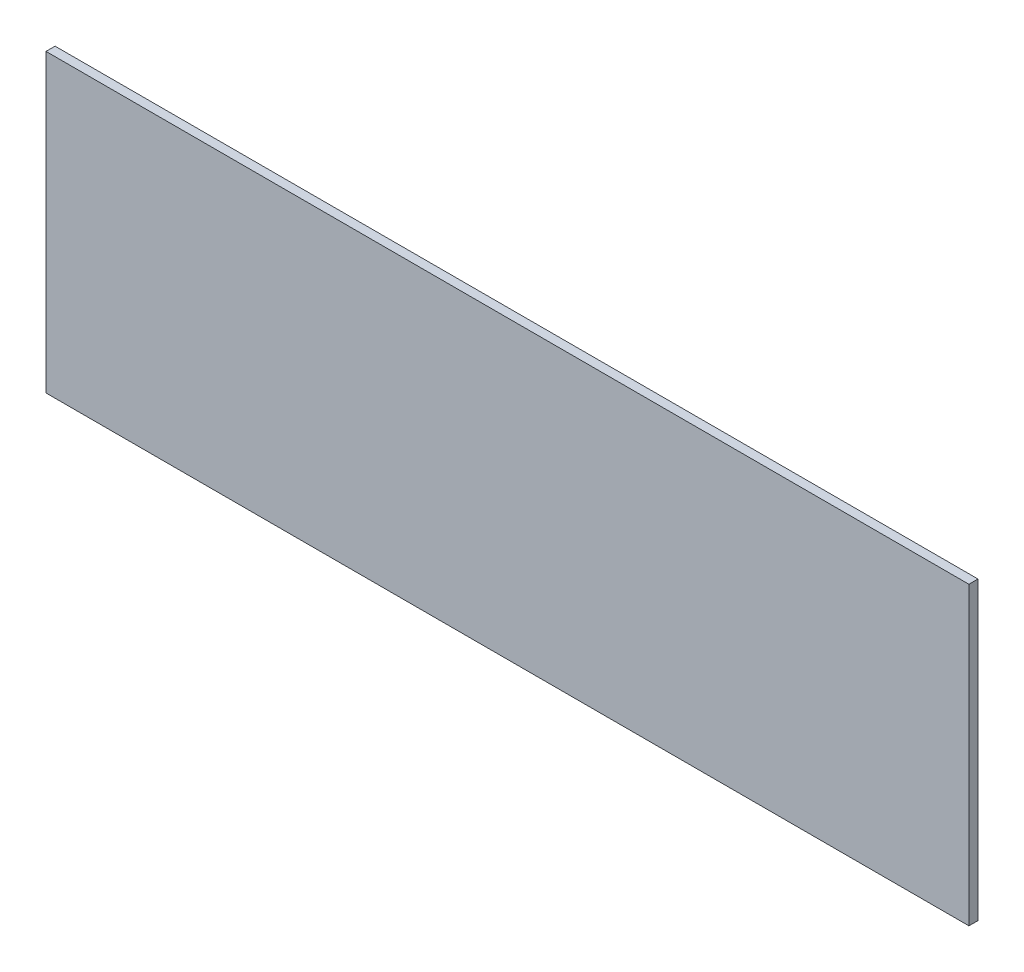
ISO-10303-21;
HEADER;
FILE_DESCRIPTION(('STEP AP214'),'2;1');
FILE_NAME('part.step','',(''),(''),'','','');
FILE_SCHEMA(('AUTOMOTIVE_DESIGN { 1 0 10303 214 1 1 1 1 }'));
ENDSEC;
DATA;
#1=APPLICATION_CONTEXT('core data for automotive mechanical design processes');
#2=APPLICATION_PROTOCOL_DEFINITION('international standard','automotive_design',2000,#1);
#3=PRODUCT_CONTEXT('',#1,'mechanical');
#4=PRODUCT('Part','Part','',(#3));
#5=PRODUCT_RELATED_PRODUCT_CATEGORY('part','',(#4));
#6=PRODUCT_DEFINITION_FORMATION('','',#4);
#7=PRODUCT_DEFINITION_CONTEXT('part definition',#1,'design');
#8=PRODUCT_DEFINITION('design','',#6,#7);
#9=PRODUCT_DEFINITION_SHAPE('','',#8);
#10=(LENGTH_UNIT() NAMED_UNIT(*) SI_UNIT(.MILLI.,.METRE.));
#11=(NAMED_UNIT(*) PLANE_ANGLE_UNIT() SI_UNIT($,.RADIAN.));
#12=(NAMED_UNIT(*) SI_UNIT($,.STERADIAN.) SOLID_ANGLE_UNIT());
#13=UNCERTAINTY_MEASURE_WITH_UNIT(LENGTH_MEASURE(1.E-05),#10,'distance_accuracy_value','');
#14=(GEOMETRIC_REPRESENTATION_CONTEXT(3) GLOBAL_UNCERTAINTY_ASSIGNED_CONTEXT((#13)) GLOBAL_UNIT_ASSIGNED_CONTEXT((#10,
#11,#12)) REPRESENTATION_CONTEXT('',''));
#15=CARTESIAN_POINT('',(0.,0.,0.));
#16=DIRECTION('',(0.,0.,1.));
#17=DIRECTION('',(1.,0.,0.));
#18=AXIS2_PLACEMENT_3D('',#15,#16,#17);
#19=CARTESIAN_POINT('',(-48.3058591698295,34.6046972198337,1.));
#20=DIRECTION('',(1.,0.,0.));
#21=DIRECTION('',(0.,0.,-1.));
#22=AXIS2_PLACEMENT_3D('',#19,#20,#21);
#23=PLANE('',#22);
#24=DIRECTION('',(0.,-1.,0.));
#25=VECTOR('',#24,1.);
#26=CARTESIAN_POINT('',(-48.3058591698295,34.6046972198337,0.));
#27=LINE('',#26,#25);
#28=CARTESIAN_POINT('',(-48.3058591698295,34.6046972198337,0.));
#29=VERTEX_POINT('',#28);
#30=CARTESIAN_POINT('',(-48.3058591698295,2.02210000082914,0.));
#31=VERTEX_POINT('',#30);
#32=EDGE_CURVE('E100',#29,#31,#27,.T.);
#33=ORIENTED_EDGE('',*,*,#32,.T.);
#34=DIRECTION('',(0.,0.,-1.));
#35=VECTOR('',#34,1.);
#36=CARTESIAN_POINT('',(-48.3058591698295,2.02210000082914,1.));
#37=LINE('',#36,#35);
#38=CARTESIAN_POINT('',(-48.3058591698295,2.02210000082914,1.));
#39=VERTEX_POINT('',#38);
#40=EDGE_CURVE('E11',#39,#31,#37,.T.);
#41=ORIENTED_EDGE('',*,*,#40,.F.);
#42=DIRECTION('',(0.,-1.,0.));
#43=VECTOR('',#42,1.);
#44=CARTESIAN_POINT('',(-48.3058591698295,34.6046972198337,1.));
#45=LINE('',#44,#43);
#46=CARTESIAN_POINT('',(-48.3058591698295,34.6046972198337,1.));
#47=VERTEX_POINT('',#46);
#48=EDGE_CURVE('E88',#47,#39,#45,.T.);
#49=ORIENTED_EDGE('',*,*,#48,.F.);
#50=DIRECTION('',(0.,0.,-1.));
#51=VECTOR('',#50,1.);
#52=CARTESIAN_POINT('',(-48.3058591698295,34.6046972198337,1.));
#53=LINE('',#52,#51);
#54=EDGE_CURVE('E96',#47,#29,#53,.T.);
#55=ORIENTED_EDGE('',*,*,#54,.T.);
#56=EDGE_LOOP('',(#33,#41,#49,#55));
#57=FACE_BOUND('',#56,.T.);
#58=ADVANCED_FACE('F37',(#57),#23,.F.);
#59=CARTESIAN_POINT('',(-48.3058591698295,2.02210000082914,1.));
#60=DIRECTION('',(0.,1.,0.));
#61=DIRECTION('',(0.,0.,1.));
#62=AXIS2_PLACEMENT_3D('',#59,#60,#61);
#63=PLANE('',#62);
#64=DIRECTION('',(1.,0.,0.));
#65=VECTOR('',#64,1.);
#66=CARTESIAN_POINT('',(-48.3058591698295,2.02210000082914,0.));
#67=LINE('',#66,#65);
#68=CARTESIAN_POINT('',(53.3404207123418,2.02210000082914,0.));
#69=VERTEX_POINT('',#68);
#70=EDGE_CURVE('E92',#31,#69,#67,.T.);
#71=ORIENTED_EDGE('',*,*,#70,.T.);
#72=DIRECTION('',(0.,0.,-1.));
#73=VECTOR('',#72,1.);
#74=CARTESIAN_POINT('',(53.3404207123418,2.02210000082914,1.));
#75=LINE('',#74,#73);
#76=CARTESIAN_POINT('',(53.3404207123418,2.02210000082914,1.));
#77=VERTEX_POINT('',#76);
#78=EDGE_CURVE('E45',#77,#69,#75,.T.);
#79=ORIENTED_EDGE('',*,*,#78,.F.);
#80=DIRECTION('',(1.,0.,0.));
#81=VECTOR('',#80,1.);
#82=CARTESIAN_POINT('',(-48.3058591698295,2.02210000082914,1.));
#83=LINE('',#82,#81);
#84=EDGE_CURVE('E83',#39,#77,#83,.T.);
#85=ORIENTED_EDGE('',*,*,#84,.F.);
#86=ORIENTED_EDGE('',*,*,#40,.T.);
#87=EDGE_LOOP('',(#71,#79,#85,#86));
#88=FACE_BOUND('',#87,.T.);
#89=ADVANCED_FACE('F91',(#88),#63,.F.);
#90=CARTESIAN_POINT('',(53.3404207123418,34.6046972198337,1.));
#91=DIRECTION('',(-1.,0.,0.));
#92=DIRECTION('',(0.,0.,1.));
#93=AXIS2_PLACEMENT_3D('',#90,#91,#92);
#94=PLANE('',#93);
#95=DIRECTION('',(0.,1.,0.));
#96=VECTOR('',#95,1.);
#97=CARTESIAN_POINT('',(53.3404207123418,34.6046972198337,0.));
#98=LINE('',#97,#96);
#99=CARTESIAN_POINT('',(53.3404207123418,34.6046972198337,0.));
#100=VERTEX_POINT('',#99);
#101=EDGE_CURVE('E70',#69,#100,#98,.T.);
#102=ORIENTED_EDGE('',*,*,#101,.T.);
#103=DIRECTION('',(0.,0.,-1.));
#104=VECTOR('',#103,1.);
#105=CARTESIAN_POINT('',(53.3404207123418,34.6046972198337,1.));
#106=LINE('',#105,#104);
#107=CARTESIAN_POINT('',(53.3404207123418,34.6046972198337,1.));
#108=VERTEX_POINT('',#107);
#109=EDGE_CURVE('E93',#108,#100,#106,.T.);
#110=ORIENTED_EDGE('',*,*,#109,.F.);
#111=DIRECTION('',(0.,1.,0.));
#112=VECTOR('',#111,1.);
#113=CARTESIAN_POINT('',(53.3404207123418,34.6046972198337,1.));
#114=LINE('',#113,#112);
#115=EDGE_CURVE('E86',#77,#108,#114,.T.);
#116=ORIENTED_EDGE('',*,*,#115,.F.);
#117=ORIENTED_EDGE('',*,*,#78,.T.);
#118=EDGE_LOOP('',(#102,#110,#116,#117));
#119=FACE_BOUND('',#118,.T.);
#120=ADVANCED_FACE('F94',(#119),#94,.F.);
#121=CARTESIAN_POINT('',(-48.3058591698295,34.6046972198337,1.));
#122=DIRECTION('',(0.,-1.,0.));
#123=DIRECTION('',(0.,0.,-1.));
#124=AXIS2_PLACEMENT_3D('',#121,#122,#123);
#125=PLANE('',#124);
#126=DIRECTION('',(-1.,0.,0.));
#127=VECTOR('',#126,1.);
#128=CARTESIAN_POINT('',(-48.3058591698295,34.6046972198337,0.));
#129=LINE('',#128,#127);
#130=EDGE_CURVE('E76',#100,#29,#129,.T.);
#131=ORIENTED_EDGE('',*,*,#130,.T.);
#132=ORIENTED_EDGE('',*,*,#54,.F.);
#133=DIRECTION('',(-1.,0.,0.));
#134=VECTOR('',#133,1.);
#135=CARTESIAN_POINT('',(-48.3058591698295,34.6046972198337,1.));
#136=LINE('',#135,#134);
#137=EDGE_CURVE('E53',#108,#47,#136,.T.);
#138=ORIENTED_EDGE('',*,*,#137,.F.);
#139=ORIENTED_EDGE('',*,*,#109,.T.);
#140=EDGE_LOOP('',(#131,#132,#138,#139));
#141=FACE_BOUND('',#140,.T.);
#142=ADVANCED_FACE('F107',(#141),#125,.F.);
#143=CARTESIAN_POINT('',(0.,0.,1.));
#144=DIRECTION('',(0.,0.,1.));
#145=DIRECTION('',(1.,0.,0.));
#146=AXIS2_PLACEMENT_3D('',#143,#144,#145);
#147=PLANE('',#146);
#148=ORIENTED_EDGE('',*,*,#48,.T.);
#149=ORIENTED_EDGE('',*,*,#84,.T.);
#150=ORIENTED_EDGE('',*,*,#115,.T.);
#151=ORIENTED_EDGE('',*,*,#137,.T.);
#152=EDGE_LOOP('',(#148,#149,#150,#151));
#153=FACE_BOUND('',#152,.T.);
#154=ADVANCED_FACE('F84',(#153),#147,.T.);
#155=CARTESIAN_POINT('',(0.,0.,0.));
#156=DIRECTION('',(0.,0.,1.));
#157=DIRECTION('',(1.,0.,0.));
#158=AXIS2_PLACEMENT_3D('',#155,#156,#157);
#159=PLANE('',#158);
#160=ORIENTED_EDGE('',*,*,#32,.F.);
#161=ORIENTED_EDGE('',*,*,#130,.F.);
#162=ORIENTED_EDGE('',*,*,#101,.F.);
#163=ORIENTED_EDGE('',*,*,#70,.F.);
#164=EDGE_LOOP('',(#160,#161,#162,#163));
#165=FACE_BOUND('',#164,.T.);
#166=ADVANCED_FACE('F110',(#165),#159,.F.);
#167=CLOSED_SHELL('',(#58,#89,#120,#142,#154,#166));
#168=MANIFOLD_SOLID_BREP('B2',#167);
#169=ADVANCED_BREP_SHAPE_REPRESENTATION('',(#18,#168),#14);
#170=SHAPE_DEFINITION_REPRESENTATION(#9,#169);
ENDSEC;
END-ISO-10303-21;
